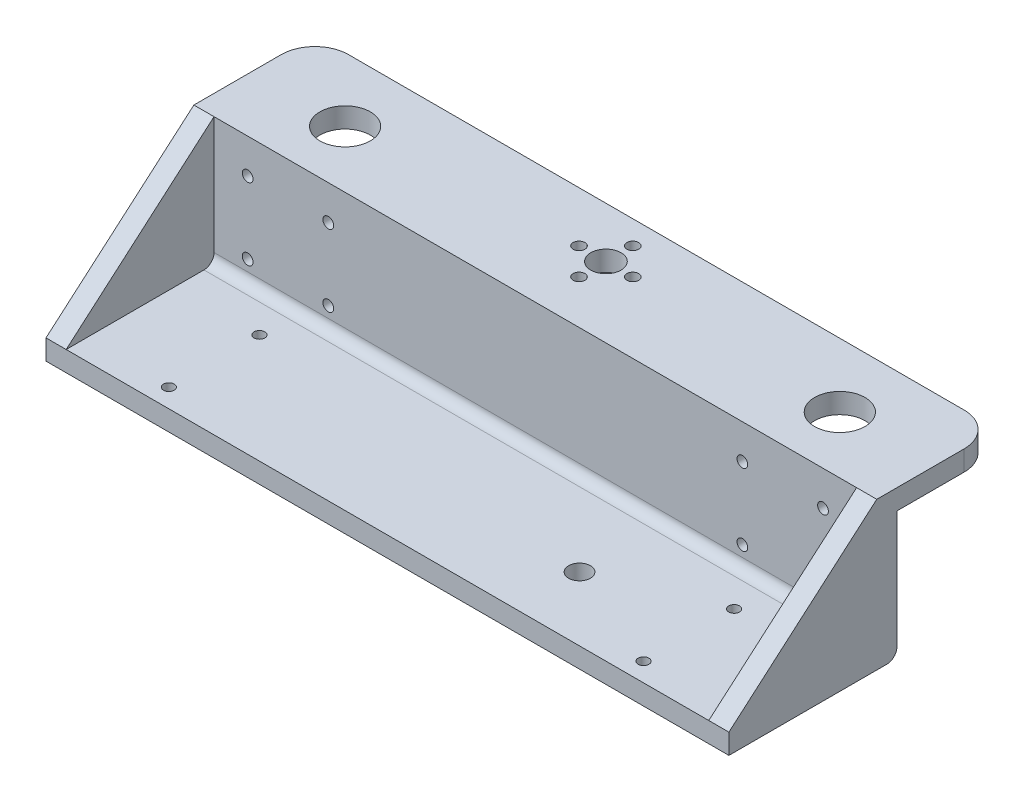
ISO-10303-21;
HEADER;
FILE_DESCRIPTION(('STEP AP214'),'2;1');
FILE_NAME('part.step','',(''),(''),'','','');
FILE_SCHEMA(('AUTOMOTIVE_DESIGN { 1 0 10303 214 1 1 1 1 }'));
ENDSEC;
DATA;
#1=APPLICATION_CONTEXT('core data for automotive mechanical design processes');
#2=APPLICATION_PROTOCOL_DEFINITION('international standard','automotive_design',2000,#1);
#3=PRODUCT_CONTEXT('',#1,'mechanical');
#4=PRODUCT('Part','Part','',(#3));
#5=PRODUCT_RELATED_PRODUCT_CATEGORY('part','',(#4));
#6=PRODUCT_DEFINITION_FORMATION('','',#4);
#7=PRODUCT_DEFINITION_CONTEXT('part definition',#1,'design');
#8=PRODUCT_DEFINITION('design','',#6,#7);
#9=PRODUCT_DEFINITION_SHAPE('','',#8);
#10=(LENGTH_UNIT() NAMED_UNIT(*) SI_UNIT(.MILLI.,.METRE.));
#11=(NAMED_UNIT(*) PLANE_ANGLE_UNIT() SI_UNIT($,.RADIAN.));
#12=(NAMED_UNIT(*) SI_UNIT($,.STERADIAN.) SOLID_ANGLE_UNIT());
#13=UNCERTAINTY_MEASURE_WITH_UNIT(LENGTH_MEASURE(1.E-05),#10,'distance_accuracy_value','');
#14=(GEOMETRIC_REPRESENTATION_CONTEXT(3) GLOBAL_UNCERTAINTY_ASSIGNED_CONTEXT((#13)) GLOBAL_UNIT_ASSIGNED_CONTEXT((#10,
#11,#12)) REPRESENTATION_CONTEXT('',''));
#15=CARTESIAN_POINT('',(0.,0.,0.));
#16=DIRECTION('',(0.,0.,1.));
#17=DIRECTION('',(1.,0.,0.));
#18=AXIS2_PLACEMENT_3D('',#15,#16,#17);
#19=CARTESIAN_POINT('',(0.,0.,6.));
#20=DIRECTION('',(0.,0.,-1.));
#21=DIRECTION('',(-1.,0.,0.));
#22=AXIS2_PLACEMENT_3D('',#19,#20,#21);
#23=PLANE('',#22);
#24=CARTESIAN_POINT('',(85.6,11.7,6.00000000000001));
#25=DIRECTION('',(0.,0.,-1.));
#26=DIRECTION('',(-1.,0.,0.));
#27=AXIS2_PLACEMENT_3D('',#24,#25,#26);
#28=CIRCLE('',#27,1.59999999999999);
#29=CARTESIAN_POINT('',(84.,11.7,6.00000000000001));
#30=VERTEX_POINT('',#29);
#31=EDGE_CURVE('E865',#30,#30,#28,.T.);
#32=ORIENTED_EDGE('',*,*,#31,.T.);
#33=EDGE_LOOP('',(#32));
#34=FACE_BOUND('',#33,.T.);
#35=CARTESIAN_POINT('',(61.6,11.7,6.00000000000001));
#36=DIRECTION('',(0.,0.,-1.));
#37=DIRECTION('',(-1.,0.,0.));
#38=AXIS2_PLACEMENT_3D('',#35,#36,#37);
#39=CIRCLE('',#38,1.59999999999999);
#40=CARTESIAN_POINT('',(60.,11.7,6.00000000000001));
#41=VERTEX_POINT('',#40);
#42=EDGE_CURVE('E857',#41,#41,#39,.T.);
#43=ORIENTED_EDGE('',*,*,#42,.T.);
#44=EDGE_LOOP('',(#43));
#45=FACE_BOUND('',#44,.T.);
#46=CARTESIAN_POINT('',(85.6,-9.7,6.00000000000001));
#47=DIRECTION('',(0.,0.,-1.));
#48=DIRECTION('',(-1.,0.,0.));
#49=AXIS2_PLACEMENT_3D('',#46,#47,#48);
#50=CIRCLE('',#49,1.59999999999999);
#51=CARTESIAN_POINT('',(84.,-9.7,6.00000000000001));
#52=VERTEX_POINT('',#51);
#53=EDGE_CURVE('E849',#52,#52,#50,.T.);
#54=ORIENTED_EDGE('',*,*,#53,.T.);
#55=EDGE_LOOP('',(#54));
#56=FACE_BOUND('',#55,.T.);
#57=CARTESIAN_POINT('',(61.6,-9.7,6.00000000000001));
#58=DIRECTION('',(0.,0.,-1.));
#59=DIRECTION('',(-1.,0.,0.));
#60=AXIS2_PLACEMENT_3D('',#57,#58,#59);
#61=CIRCLE('',#60,1.59999999999999);
#62=CARTESIAN_POINT('',(60.,-9.7,6.00000000000001));
#63=VERTEX_POINT('',#62);
#64=EDGE_CURVE('E841',#63,#63,#61,.T.);
#65=ORIENTED_EDGE('',*,*,#64,.T.);
#66=EDGE_LOOP('',(#65));
#67=FACE_BOUND('',#66,.T.);
#68=CARTESIAN_POINT('',(-61.6,11.7,6.00000000000001));
#69=DIRECTION('',(0.,0.,-1.));
#70=DIRECTION('',(-1.,0.,0.));
#71=AXIS2_PLACEMENT_3D('',#68,#69,#70);
#72=CIRCLE('',#71,1.59999999999999);
#73=CARTESIAN_POINT('',(-63.2,11.7,6.00000000000001));
#74=VERTEX_POINT('',#73);
#75=EDGE_CURVE('E833',#74,#74,#72,.T.);
#76=ORIENTED_EDGE('',*,*,#75,.T.);
#77=EDGE_LOOP('',(#76));
#78=FACE_BOUND('',#77,.T.);
#79=CARTESIAN_POINT('',(-85.6,11.7,6.00000000000001));
#80=DIRECTION('',(0.,0.,-1.));
#81=DIRECTION('',(-1.,0.,0.));
#82=AXIS2_PLACEMENT_3D('',#79,#80,#81);
#83=CIRCLE('',#82,1.59999999999999);
#84=CARTESIAN_POINT('',(-87.2,11.7,6.00000000000001));
#85=VERTEX_POINT('',#84);
#86=EDGE_CURVE('E807',#85,#85,#83,.T.);
#87=ORIENTED_EDGE('',*,*,#86,.T.);
#88=EDGE_LOOP('',(#87));
#89=FACE_BOUND('',#88,.T.);
#90=CARTESIAN_POINT('',(-61.6,-9.69999999999998,6.00000000000001));
#91=DIRECTION('',(0.,0.,-1.));
#92=DIRECTION('',(-1.,0.,0.));
#93=AXIS2_PLACEMENT_3D('',#90,#91,#92);
#94=CIRCLE('',#93,1.59999999999999);
#95=CARTESIAN_POINT('',(-63.2,-9.69999999999998,6.00000000000001));
#96=VERTEX_POINT('',#95);
#97=EDGE_CURVE('E801',#96,#96,#94,.T.);
#98=ORIENTED_EDGE('',*,*,#97,.T.);
#99=EDGE_LOOP('',(#98));
#100=FACE_BOUND('',#99,.T.);
#101=CARTESIAN_POINT('',(-85.6,-9.69999999999998,6.00000000000001));
#102=DIRECTION('',(0.,0.,-1.));
#103=DIRECTION('',(-1.,0.,0.));
#104=AXIS2_PLACEMENT_3D('',#101,#102,#103);
#105=CIRCLE('',#104,1.59999999999999);
#106=CARTESIAN_POINT('',(-87.2,-9.69999999999998,6.00000000000001));
#107=VERTEX_POINT('',#106);
#108=EDGE_CURVE('E821',#107,#107,#105,.T.);
#109=ORIENTED_EDGE('',*,*,#108,.T.);
#110=EDGE_LOOP('',(#109));
#111=FACE_BOUND('',#110,.T.);
#112=DIRECTION('',(0.,1.,0.));
#113=VECTOR('',#112,1.);
#114=CARTESIAN_POINT('',(-95.6,0.,6.));
#115=LINE('',#114,#113);
#116=CARTESIAN_POINT('',(-95.6,-13.,6.));
#117=VERTEX_POINT('',#116);
#118=CARTESIAN_POINT('',(-95.6,22.,6.));
#119=VERTEX_POINT('',#118);
#120=EDGE_CURVE('E151',#117,#119,#115,.T.);
#121=ORIENTED_EDGE('',*,*,#120,.F.);
#122=DIRECTION('',(1.,0.,0.));
#123=VECTOR('',#122,1.);
#124=CARTESIAN_POINT('',(95.6,-13.,6.));
#125=LINE('',#124,#123);
#126=CARTESIAN_POINT('',(95.6,-13.,6.));
#127=VERTEX_POINT('',#126);
#128=EDGE_CURVE('E305',#117,#127,#125,.T.);
#129=ORIENTED_EDGE('',*,*,#128,.T.);
#130=DIRECTION('',(0.,-1.,0.));
#131=VECTOR('',#130,1.);
#132=CARTESIAN_POINT('',(95.6,0.,6.));
#133=LINE('',#132,#131);
#134=CARTESIAN_POINT('',(95.6,22.,6.));
#135=VERTEX_POINT('',#134);
#136=EDGE_CURVE('E183',#135,#127,#133,.T.);
#137=ORIENTED_EDGE('',*,*,#136,.F.);
#138=DIRECTION('',(1.,0.,0.));
#139=VECTOR('',#138,1.);
#140=CARTESIAN_POINT('',(101.6,22.,6.));
#141=LINE('',#140,#139);
#142=EDGE_CURVE('E268',#119,#135,#141,.T.);
#143=ORIENTED_EDGE('',*,*,#142,.F.);
#144=EDGE_LOOP('',(#121,#129,#137,#143));
#145=FACE_BOUND('',#144,.T.);
#146=ADVANCED_FACE('F39',(#34,#45,#56,#67,#78,#89,#100,#111,#145),#23,.F.);
#147=CARTESIAN_POINT('',(0.,-16.,0.));
#148=DIRECTION('',(0.,-1.,0.));
#149=DIRECTION('',(0.,0.,-1.));
#150=AXIS2_PLACEMENT_3D('',#147,#148,#149);
#151=PLANE('',#150);
#152=CARTESIAN_POINT('',(-70.62,-16.,17.48));
#153=DIRECTION('',(0.,1.,0.));
#154=DIRECTION('',(0.,0.,1.));
#155=AXIS2_PLACEMENT_3D('',#152,#153,#154);
#156=CIRCLE('',#155,1.6);
#157=CARTESIAN_POINT('',(-70.62,-16.,19.08));
#158=VERTEX_POINT('',#157);
#159=EDGE_CURVE('E908',#158,#158,#156,.T.);
#160=ORIENTED_EDGE('',*,*,#159,.F.);
#161=EDGE_LOOP('',(#160));
#162=FACE_BOUND('',#161,.T.);
#163=CARTESIAN_POINT('',(-70.62,-16.,44.42));
#164=DIRECTION('',(0.,1.,0.));
#165=DIRECTION('',(0.,0.,1.));
#166=AXIS2_PLACEMENT_3D('',#163,#164,#165);
#167=CIRCLE('',#166,1.6);
#168=CARTESIAN_POINT('',(-70.62,-16.,46.02));
#169=VERTEX_POINT('',#168);
#170=EDGE_CURVE('E900',#169,#169,#167,.T.);
#171=ORIENTED_EDGE('',*,*,#170,.F.);
#172=EDGE_LOOP('',(#171));
#173=FACE_BOUND('',#172,.T.);
#174=CARTESIAN_POINT('',(70.62,-16.,17.48));
#175=DIRECTION('',(0.,1.,0.));
#176=DIRECTION('',(0.,0.,1.));
#177=AXIS2_PLACEMENT_3D('',#174,#175,#176);
#178=CIRCLE('',#177,1.6);
#179=CARTESIAN_POINT('',(70.62,-16.,19.08));
#180=VERTEX_POINT('',#179);
#181=EDGE_CURVE('E892',#180,#180,#178,.T.);
#182=ORIENTED_EDGE('',*,*,#181,.F.);
#183=EDGE_LOOP('',(#182));
#184=FACE_BOUND('',#183,.T.);
#185=CARTESIAN_POINT('',(70.62,-16.,44.42));
#186=DIRECTION('',(0.,1.,0.));
#187=DIRECTION('',(0.,0.,1.));
#188=AXIS2_PLACEMENT_3D('',#185,#186,#187);
#189=CIRCLE('',#188,1.6);
#190=CARTESIAN_POINT('',(70.62,-16.,46.02));
#191=VERTEX_POINT('',#190);
#192=EDGE_CURVE('E884',#191,#191,#189,.T.);
#193=ORIENTED_EDGE('',*,*,#192,.F.);
#194=EDGE_LOOP('',(#193));
#195=FACE_BOUND('',#194,.T.);
#196=CARTESIAN_POINT('',(38.1,-16.,30.95));
#197=DIRECTION('',(0.,-1.,0.));
#198=DIRECTION('',(0.,0.,-1.));
#199=AXIS2_PLACEMENT_3D('',#196,#197,#198);
#200=CIRCLE('',#199,3.2385);
#201=CARTESIAN_POINT('',(38.1,-16.,27.7115));
#202=VERTEX_POINT('',#201);
#203=EDGE_CURVE('E872',#202,#202,#200,.T.);
#204=ORIENTED_EDGE('',*,*,#203,.T.);
#205=EDGE_LOOP('',(#204));
#206=FACE_BOUND('',#205,.T.);
#207=DIRECTION('',(0.,0.,-1.));
#208=VECTOR('',#207,1.);
#209=CARTESIAN_POINT('',(95.6,-16.,0.));
#210=LINE('',#209,#208);
#211=CARTESIAN_POINT('',(95.6,-16.,50.));
#212=VERTEX_POINT('',#211);
#213=CARTESIAN_POINT('',(95.6,-16.,9.));
#214=VERTEX_POINT('',#213);
#215=EDGE_CURVE('E408',#212,#214,#210,.T.);
#216=ORIENTED_EDGE('',*,*,#215,.T.);
#217=DIRECTION('',(1.,0.,0.));
#218=VECTOR('',#217,1.);
#219=CARTESIAN_POINT('',(-95.6,-16.,9.));
#220=LINE('',#219,#218);
#221=CARTESIAN_POINT('',(-95.6,-16.,9.));
#222=VERTEX_POINT('',#221);
#223=EDGE_CURVE('E175',#214,#222,#220,.F.);
#224=ORIENTED_EDGE('',*,*,#223,.T.);
#225=DIRECTION('',(0.,0.,-1.));
#226=VECTOR('',#225,1.);
#227=CARTESIAN_POINT('',(-95.6,-16.,0.));
#228=LINE('',#227,#226);
#229=CARTESIAN_POINT('',(-95.6,-16.,50.));
#230=VERTEX_POINT('',#229);
#231=EDGE_CURVE('E148',#230,#222,#228,.T.);
#232=ORIENTED_EDGE('',*,*,#231,.F.);
#233=DIRECTION('',(-1.,0.,0.));
#234=VECTOR('',#233,1.);
#235=CARTESIAN_POINT('',(101.6,-16.,50.));
#236=LINE('',#235,#234);
#237=EDGE_CURVE('E172',#212,#230,#236,.T.);
#238=ORIENTED_EDGE('',*,*,#237,.F.);
#239=EDGE_LOOP('',(#216,#224,#232,#238));
#240=FACE_BOUND('',#239,.T.);
#241=ADVANCED_FACE('F171',(#162,#173,#184,#195,#206,#240),#151,.F.);
#242=CARTESIAN_POINT('',(101.6,-16.,6.));
#243=DIRECTION('',(-1.,0.,0.));
#244=DIRECTION('',(0.,0.,1.));
#245=AXIS2_PLACEMENT_3D('',#242,#243,#244);
#246=PLANE('',#245);
#247=DIRECTION('',(0.,0.,-1.));
#248=VECTOR('',#247,1.);
#249=CARTESIAN_POINT('',(101.6,16.,6.));
#250=LINE('',#249,#248);
#251=CARTESIAN_POINT('',(101.6,16.,0.));
#252=VERTEX_POINT('',#251);
#253=CARTESIAN_POINT('',(101.6,16.,-20.));
#254=VERTEX_POINT('',#253);
#255=EDGE_CURVE('E257',#252,#254,#250,.T.);
#256=ORIENTED_EDGE('',*,*,#255,.T.);
#257=DIRECTION('',(0.,-1.,0.));
#258=VECTOR('',#257,1.);
#259=CARTESIAN_POINT('',(101.6,-16.,-20.));
#260=LINE('',#259,#258);
#261=CARTESIAN_POINT('',(101.6,22.,-20.));
#262=VERTEX_POINT('',#261);
#263=EDGE_CURVE('E63',#254,#262,#260,.F.);
#264=ORIENTED_EDGE('',*,*,#263,.T.);
#265=DIRECTION('',(0.,0.,-1.));
#266=VECTOR('',#265,1.);
#267=CARTESIAN_POINT('',(101.6,22.,6.));
#268=LINE('',#267,#266);
#269=CARTESIAN_POINT('',(101.6,22.,6.));
#270=VERTEX_POINT('',#269);
#271=EDGE_CURVE('E258',#270,#262,#268,.T.);
#272=ORIENTED_EDGE('',*,*,#271,.F.);
#273=DIRECTION('',(0.,-0.653619870346092,0.75682300776916));
#274=VECTOR('',#273,1.);
#275=CARTESIAN_POINT('',(101.6,-16.,50.));
#276=LINE('',#275,#274);
#277=CARTESIAN_POINT('',(101.6,-16.,50.));
#278=VERTEX_POINT('',#277);
#279=EDGE_CURVE('E405',#270,#278,#276,.T.);
#280=ORIENTED_EDGE('',*,*,#279,.T.);
#281=DIRECTION('',(0.,1.,0.));
#282=VECTOR('',#281,1.);
#283=CARTESIAN_POINT('',(101.6,-22.,50.));
#284=LINE('',#283,#282);
#285=CARTESIAN_POINT('',(101.6,-22.,50.));
#286=VERTEX_POINT('',#285);
#287=EDGE_CURVE('E198',#286,#278,#284,.T.);
#288=ORIENTED_EDGE('',*,*,#287,.F.);
#289=DIRECTION('',(0.,0.,1.));
#290=VECTOR('',#289,1.);
#291=CARTESIAN_POINT('',(101.6,-22.,0.));
#292=LINE('',#291,#290);
#293=CARTESIAN_POINT('',(101.6,-22.,3.));
#294=VERTEX_POINT('',#293);
#295=EDGE_CURVE('E187',#294,#286,#292,.T.);
#296=ORIENTED_EDGE('',*,*,#295,.F.);
#297=CARTESIAN_POINT('',(101.6,-19.,3.));
#298=DIRECTION('',(-1.,0.,0.));
#299=DIRECTION('',(0.,0.,1.));
#300=AXIS2_PLACEMENT_3D('',#297,#298,#299);
#301=CIRCLE('',#300,3.);
#302=CARTESIAN_POINT('',(101.6,-19.,0.));
#303=VERTEX_POINT('',#302);
#304=EDGE_CURVE('E296',#294,#303,#301,.F.);
#305=ORIENTED_EDGE('',*,*,#304,.T.);
#306=DIRECTION('',(0.,1.,0.));
#307=VECTOR('',#306,1.);
#308=CARTESIAN_POINT('',(101.6,-16.,0.));
#309=LINE('',#308,#307);
#310=EDGE_CURVE('E273',#303,#252,#309,.T.);
#311=ORIENTED_EDGE('',*,*,#310,.T.);
#312=EDGE_LOOP('',(#256,#264,#272,#280,#288,#296,#305,#311));
#313=FACE_BOUND('',#312,.T.);
#314=ADVANCED_FACE('F349',(#313),#246,.F.);
#315=CARTESIAN_POINT('',(-101.6,-16.,6.));
#316=DIRECTION('',(1.,0.,0.));
#317=DIRECTION('',(0.,0.,-1.));
#318=AXIS2_PLACEMENT_3D('',#315,#316,#317);
#319=PLANE('',#318);
#320=DIRECTION('',(0.,0.,1.));
#321=VECTOR('',#320,1.);
#322=CARTESIAN_POINT('',(-101.6,22.,6.));
#323=LINE('',#322,#321);
#324=CARTESIAN_POINT('',(-101.6,22.,-20.));
#325=VERTEX_POINT('',#324);
#326=CARTESIAN_POINT('',(-101.6,22.,6.));
#327=VERTEX_POINT('',#326);
#328=EDGE_CURVE('E265',#325,#327,#323,.T.);
#329=ORIENTED_EDGE('',*,*,#328,.F.);
#330=DIRECTION('',(0.,-1.,0.));
#331=VECTOR('',#330,1.);
#332=CARTESIAN_POINT('',(-101.6,-16.,-20.));
#333=LINE('',#332,#331);
#334=CARTESIAN_POINT('',(-101.6,16.,-20.));
#335=VERTEX_POINT('',#334);
#336=EDGE_CURVE('E11',#325,#335,#333,.T.);
#337=ORIENTED_EDGE('',*,*,#336,.T.);
#338=DIRECTION('',(0.,0.,1.));
#339=VECTOR('',#338,1.);
#340=CARTESIAN_POINT('',(-101.6,16.,6.));
#341=LINE('',#340,#339);
#342=CARTESIAN_POINT('',(-101.6,16.,0.));
#343=VERTEX_POINT('',#342);
#344=EDGE_CURVE('E262',#335,#343,#341,.T.);
#345=ORIENTED_EDGE('',*,*,#344,.T.);
#346=DIRECTION('',(0.,-1.,0.));
#347=VECTOR('',#346,1.);
#348=CARTESIAN_POINT('',(-101.6,-16.,0.));
#349=LINE('',#348,#347);
#350=CARTESIAN_POINT('',(-101.6,-19.,0.));
#351=VERTEX_POINT('',#350);
#352=EDGE_CURVE('E288',#343,#351,#349,.T.);
#353=ORIENTED_EDGE('',*,*,#352,.T.);
#354=CARTESIAN_POINT('',(-101.6,-19.,3.));
#355=DIRECTION('',(1.,0.,0.));
#356=DIRECTION('',(0.,0.,-1.));
#357=AXIS2_PLACEMENT_3D('',#354,#355,#356);
#358=CIRCLE('',#357,3.);
#359=CARTESIAN_POINT('',(-101.6,-22.,3.));
#360=VERTEX_POINT('',#359);
#361=EDGE_CURVE('E302',#351,#360,#358,.F.);
#362=ORIENTED_EDGE('',*,*,#361,.T.);
#363=DIRECTION('',(0.,0.,-1.));
#364=VECTOR('',#363,1.);
#365=CARTESIAN_POINT('',(-101.6,-22.,0.));
#366=LINE('',#365,#364);
#367=CARTESIAN_POINT('',(-101.6,-22.,50.));
#368=VERTEX_POINT('',#367);
#369=EDGE_CURVE('E193',#368,#360,#366,.T.);
#370=ORIENTED_EDGE('',*,*,#369,.F.);
#371=DIRECTION('',(0.,1.,0.));
#372=VECTOR('',#371,1.);
#373=CARTESIAN_POINT('',(-101.6,-22.,50.));
#374=LINE('',#373,#372);
#375=CARTESIAN_POINT('',(-101.6,-16.,50.));
#376=VERTEX_POINT('',#375);
#377=EDGE_CURVE('E195',#368,#376,#374,.T.);
#378=ORIENTED_EDGE('',*,*,#377,.T.);
#379=DIRECTION('',(0.,-0.653619870346092,0.75682300776916));
#380=VECTOR('',#379,1.);
#381=CARTESIAN_POINT('',(-101.6,-16.,50.));
#382=LINE('',#381,#380);
#383=EDGE_CURVE('E161',#327,#376,#382,.T.);
#384=ORIENTED_EDGE('',*,*,#383,.F.);
#385=EDGE_LOOP('',(#329,#337,#345,#353,#362,#370,#378,#384));
#386=FACE_BOUND('',#385,.T.);
#387=ADVANCED_FACE('F359',(#386),#319,.F.);
#388=CARTESIAN_POINT('',(0.,0.,0.));
#389=DIRECTION('',(0.,0.,-1.));
#390=DIRECTION('',(-1.,0.,0.));
#391=AXIS2_PLACEMENT_3D('',#388,#389,#390);
#392=PLANE('',#391);
#393=CARTESIAN_POINT('',(85.6,11.7,0.));
#394=DIRECTION('',(0.,0.,-1.));
#395=DIRECTION('',(-1.,0.,0.));
#396=AXIS2_PLACEMENT_3D('',#393,#394,#395);
#397=CIRCLE('',#396,1.59999999999999);
#398=CARTESIAN_POINT('',(84.,11.7,0.));
#399=VERTEX_POINT('',#398);
#400=EDGE_CURVE('E868',#399,#399,#397,.T.);
#401=ORIENTED_EDGE('',*,*,#400,.F.);
#402=EDGE_LOOP('',(#401));
#403=FACE_BOUND('',#402,.T.);
#404=CARTESIAN_POINT('',(61.6,11.7,0.));
#405=DIRECTION('',(0.,0.,-1.));
#406=DIRECTION('',(-1.,0.,0.));
#407=AXIS2_PLACEMENT_3D('',#404,#405,#406);
#408=CIRCLE('',#407,1.59999999999999);
#409=CARTESIAN_POINT('',(60.,11.7,0.));
#410=VERTEX_POINT('',#409);
#411=EDGE_CURVE('E861',#410,#410,#408,.T.);
#412=ORIENTED_EDGE('',*,*,#411,.F.);
#413=EDGE_LOOP('',(#412));
#414=FACE_BOUND('',#413,.T.);
#415=CARTESIAN_POINT('',(85.6,-9.7,0.));
#416=DIRECTION('',(0.,0.,-1.));
#417=DIRECTION('',(-1.,0.,0.));
#418=AXIS2_PLACEMENT_3D('',#415,#416,#417);
#419=CIRCLE('',#418,1.59999999999999);
#420=CARTESIAN_POINT('',(84.,-9.7,0.));
#421=VERTEX_POINT('',#420);
#422=EDGE_CURVE('E853',#421,#421,#419,.T.);
#423=ORIENTED_EDGE('',*,*,#422,.F.);
#424=EDGE_LOOP('',(#423));
#425=FACE_BOUND('',#424,.T.);
#426=CARTESIAN_POINT('',(61.6,-9.7,0.));
#427=DIRECTION('',(0.,0.,-1.));
#428=DIRECTION('',(-1.,0.,0.));
#429=AXIS2_PLACEMENT_3D('',#426,#427,#428);
#430=CIRCLE('',#429,1.59999999999999);
#431=CARTESIAN_POINT('',(60.,-9.7,0.));
#432=VERTEX_POINT('',#431);
#433=EDGE_CURVE('E845',#432,#432,#430,.T.);
#434=ORIENTED_EDGE('',*,*,#433,.F.);
#435=EDGE_LOOP('',(#434));
#436=FACE_BOUND('',#435,.T.);
#437=CARTESIAN_POINT('',(-61.6,11.7,0.));
#438=DIRECTION('',(0.,0.,-1.));
#439=DIRECTION('',(-1.,0.,0.));
#440=AXIS2_PLACEMENT_3D('',#437,#438,#439);
#441=CIRCLE('',#440,1.59999999999999);
#442=CARTESIAN_POINT('',(-63.2,11.7,0.));
#443=VERTEX_POINT('',#442);
#444=EDGE_CURVE('E837',#443,#443,#441,.T.);
#445=ORIENTED_EDGE('',*,*,#444,.F.);
#446=EDGE_LOOP('',(#445));
#447=FACE_BOUND('',#446,.T.);
#448=CARTESIAN_POINT('',(-85.6,11.7,0.));
#449=DIRECTION('',(0.,0.,-1.));
#450=DIRECTION('',(-1.,0.,0.));
#451=AXIS2_PLACEMENT_3D('',#448,#449,#450);
#452=CIRCLE('',#451,1.59999999999999);
#453=CARTESIAN_POINT('',(-87.2,11.7,0.));
#454=VERTEX_POINT('',#453);
#455=EDGE_CURVE('E814',#454,#454,#452,.T.);
#456=ORIENTED_EDGE('',*,*,#455,.F.);
#457=EDGE_LOOP('',(#456));
#458=FACE_BOUND('',#457,.T.);
#459=CARTESIAN_POINT('',(-61.6,-9.69999999999998,0.));
#460=DIRECTION('',(0.,0.,-1.));
#461=DIRECTION('',(-1.,0.,0.));
#462=AXIS2_PLACEMENT_3D('',#459,#460,#461);
#463=CIRCLE('',#462,1.59999999999999);
#464=CARTESIAN_POINT('',(-63.2,-9.69999999999998,0.));
#465=VERTEX_POINT('',#464);
#466=EDGE_CURVE('E804',#465,#465,#463,.T.);
#467=ORIENTED_EDGE('',*,*,#466,.F.);
#468=EDGE_LOOP('',(#467));
#469=FACE_BOUND('',#468,.T.);
#470=CARTESIAN_POINT('',(-85.6,-9.69999999999998,0.));
#471=DIRECTION('',(0.,0.,-1.));
#472=DIRECTION('',(-1.,0.,0.));
#473=AXIS2_PLACEMENT_3D('',#470,#471,#472);
#474=CIRCLE('',#473,1.59999999999999);
#475=CARTESIAN_POINT('',(-87.2,-9.69999999999998,0.));
#476=VERTEX_POINT('',#475);
#477=EDGE_CURVE('E811',#476,#476,#474,.T.);
#478=ORIENTED_EDGE('',*,*,#477,.F.);
#479=EDGE_LOOP('',(#478));
#480=FACE_BOUND('',#479,.T.);
#481=ORIENTED_EDGE('',*,*,#310,.F.);
#482=DIRECTION('',(1.,0.,0.));
#483=VECTOR('',#482,1.);
#484=CARTESIAN_POINT('',(0.,-19.,0.));
#485=LINE('',#484,#483);
#486=EDGE_CURVE('E299',#303,#351,#485,.F.);
#487=ORIENTED_EDGE('',*,*,#486,.T.);
#488=ORIENTED_EDGE('',*,*,#352,.F.);
#489=DIRECTION('',(-1.,0.,0.));
#490=VECTOR('',#489,1.);
#491=CARTESIAN_POINT('',(-101.6,16.,0.));
#492=LINE('',#491,#490);
#493=EDGE_CURVE('E284',#252,#343,#492,.T.);
#494=ORIENTED_EDGE('',*,*,#493,.F.);
#495=EDGE_LOOP('',(#481,#487,#488,#494));
#496=FACE_BOUND('',#495,.T.);
#497=ADVANCED_FACE('F356',(#403,#414,#425,#436,#447,#458,#469,#480,#496),#392,.T.);
#498=CARTESIAN_POINT('',(0.,16.,0.));
#499=DIRECTION('',(0.,1.,0.));
#500=DIRECTION('',(0.,0.,1.));
#501=AXIS2_PLACEMENT_3D('',#498,#499,#500);
#502=PLANE('',#501);
#503=CARTESIAN_POINT('',(-73.6,16.,-11.));
#504=DIRECTION('',(0.,1.,0.));
#505=DIRECTION('',(0.,0.,1.));
#506=AXIS2_PLACEMENT_3D('',#503,#504,#505);
#507=CIRCLE('',#506,7.5);
#508=CARTESIAN_POINT('',(-73.6,16.,-3.5));
#509=VERTEX_POINT('',#508);
#510=EDGE_CURVE('E253',#509,#509,#507,.T.);
#511=ORIENTED_EDGE('',*,*,#510,.T.);
#512=EDGE_LOOP('',(#511));
#513=FACE_BOUND('',#512,.T.);
#514=CARTESIAN_POINT('',(-8.,16.,-15.));
#515=DIRECTION('',(0.,1.,0.));
#516=DIRECTION('',(0.,0.,1.));
#517=AXIS2_PLACEMENT_3D('',#514,#515,#516);
#518=CIRCLE('',#517,1.75);
#519=CARTESIAN_POINT('',(-8.,16.,-13.25));
#520=VERTEX_POINT('',#519);
#521=EDGE_CURVE('E249',#520,#520,#518,.T.);
#522=ORIENTED_EDGE('',*,*,#521,.T.);
#523=EDGE_LOOP('',(#522));
#524=FACE_BOUND('',#523,.T.);
#525=CARTESIAN_POINT('',(8.,16.,-15.));
#526=DIRECTION('',(0.,1.,0.));
#527=DIRECTION('',(0.,0.,1.));
#528=AXIS2_PLACEMENT_3D('',#525,#526,#527);
#529=CIRCLE('',#528,1.75);
#530=CARTESIAN_POINT('',(8.,16.,-13.25));
#531=VERTEX_POINT('',#530);
#532=EDGE_CURVE('E245',#531,#531,#529,.T.);
#533=ORIENTED_EDGE('',*,*,#532,.T.);
#534=EDGE_LOOP('',(#533));
#535=FACE_BOUND('',#534,.T.);
#536=CARTESIAN_POINT('',(73.6,16.,-11.));
#537=DIRECTION('',(0.,1.,0.));
#538=DIRECTION('',(0.,0.,1.));
#539=AXIS2_PLACEMENT_3D('',#536,#537,#538);
#540=CIRCLE('',#539,7.50000000000001);
#541=CARTESIAN_POINT('',(73.6,16.,-3.49999999999999));
#542=VERTEX_POINT('',#541);
#543=EDGE_CURVE('E241',#542,#542,#540,.T.);
#544=ORIENTED_EDGE('',*,*,#543,.T.);
#545=EDGE_LOOP('',(#544));
#546=FACE_BOUND('',#545,.T.);
#547=CARTESIAN_POINT('',(0.,16.,-15.));
#548=DIRECTION('',(0.,1.,0.));
#549=DIRECTION('',(0.,0.,1.));
#550=AXIS2_PLACEMENT_3D('',#547,#548,#549);
#551=CIRCLE('',#550,4.5);
#552=CARTESIAN_POINT('',(0.,16.,-10.5));
#553=VERTEX_POINT('',#552);
#554=EDGE_CURVE('E237',#553,#553,#551,.T.);
#555=ORIENTED_EDGE('',*,*,#554,.T.);
#556=EDGE_LOOP('',(#555));
#557=FACE_BOUND('',#556,.T.);
#558=CARTESIAN_POINT('',(0.,16.,-23.));
#559=DIRECTION('',(0.,1.,0.));
#560=DIRECTION('',(0.,0.,1.));
#561=AXIS2_PLACEMENT_3D('',#558,#559,#560);
#562=CIRCLE('',#561,1.75);
#563=CARTESIAN_POINT('',(0.,16.,-21.25));
#564=VERTEX_POINT('',#563);
#565=EDGE_CURVE('E233',#564,#564,#562,.T.);
#566=ORIENTED_EDGE('',*,*,#565,.T.);
#567=EDGE_LOOP('',(#566));
#568=FACE_BOUND('',#567,.T.);
#569=CARTESIAN_POINT('',(0.,16.,-7.));
#570=DIRECTION('',(0.,1.,0.));
#571=DIRECTION('',(0.,0.,1.));
#572=AXIS2_PLACEMENT_3D('',#569,#570,#571);
#573=CIRCLE('',#572,1.75);
#574=CARTESIAN_POINT('',(0.,16.,-5.25));
#575=VERTEX_POINT('',#574);
#576=EDGE_CURVE('E206',#575,#575,#573,.T.);
#577=ORIENTED_EDGE('',*,*,#576,.T.);
#578=EDGE_LOOP('',(#577));
#579=FACE_BOUND('',#578,.T.);
#580=DIRECTION('',(-1.,0.,0.));
#581=VECTOR('',#580,1.);
#582=CARTESIAN_POINT('',(101.6,16.,-30.));
#583=LINE('',#582,#581);
#584=CARTESIAN_POINT('',(91.6,16.,-30.));
#585=VERTEX_POINT('',#584);
#586=CARTESIAN_POINT('',(-91.6,16.,-30.));
#587=VERTEX_POINT('',#586);
#588=EDGE_CURVE('E276',#585,#587,#583,.T.);
#589=ORIENTED_EDGE('',*,*,#588,.F.);
#590=CARTESIAN_POINT('',(91.6,16.,-20.));
#591=DIRECTION('',(0.,1.,0.));
#592=DIRECTION('',(0.,0.,1.));
#593=AXIS2_PLACEMENT_3D('',#590,#591,#592);
#594=CIRCLE('',#593,10.);
#595=EDGE_CURVE('E327',#585,#254,#594,.F.);
#596=ORIENTED_EDGE('',*,*,#595,.T.);
#597=ORIENTED_EDGE('',*,*,#255,.F.);
#598=ORIENTED_EDGE('',*,*,#493,.T.);
#599=ORIENTED_EDGE('',*,*,#344,.F.);
#600=CARTESIAN_POINT('',(-91.6,16.,-20.));
#601=DIRECTION('',(0.,1.,0.));
#602=DIRECTION('',(0.,0.,1.));
#603=AXIS2_PLACEMENT_3D('',#600,#601,#602);
#604=CIRCLE('',#603,10.);
#605=EDGE_CURVE('E324',#335,#587,#604,.F.);
#606=ORIENTED_EDGE('',*,*,#605,.T.);
#607=EDGE_LOOP('',(#589,#596,#597,#598,#599,#606));
#608=FACE_BOUND('',#607,.T.);
#609=ADVANCED_FACE('F348',(#513,#524,#535,#546,#557,#568,#579,#608),#502,.F.);
#610=CARTESIAN_POINT('',(101.6,22.,-30.));
#611=DIRECTION('',(0.,0.,1.));
#612=DIRECTION('',(1.,0.,0.));
#613=AXIS2_PLACEMENT_3D('',#610,#611,#612);
#614=PLANE('',#613);
#615=DIRECTION('',(-1.,0.,0.));
#616=VECTOR('',#615,1.);
#617=CARTESIAN_POINT('',(101.6,22.,-30.));
#618=LINE('',#617,#616);
#619=CARTESIAN_POINT('',(91.6,22.,-30.));
#620=VERTEX_POINT('',#619);
#621=CARTESIAN_POINT('',(-91.6,22.,-30.));
#622=VERTEX_POINT('',#621);
#623=EDGE_CURVE('E261',#620,#622,#618,.T.);
#624=ORIENTED_EDGE('',*,*,#623,.F.);
#625=DIRECTION('',(0.,-1.,0.));
#626=VECTOR('',#625,1.);
#627=CARTESIAN_POINT('',(91.6,22.,-30.));
#628=LINE('',#627,#626);
#629=EDGE_CURVE('E320',#620,#585,#628,.T.);
#630=ORIENTED_EDGE('',*,*,#629,.T.);
#631=ORIENTED_EDGE('',*,*,#588,.T.);
#632=DIRECTION('',(0.,-1.,0.));
#633=VECTOR('',#632,1.);
#634=CARTESIAN_POINT('',(-91.6,22.,-30.));
#635=LINE('',#634,#633);
#636=EDGE_CURVE('E317',#587,#622,#635,.F.);
#637=ORIENTED_EDGE('',*,*,#636,.T.);
#638=EDGE_LOOP('',(#624,#630,#631,#637));
#639=FACE_BOUND('',#638,.T.);
#640=ADVANCED_FACE('F342',(#639),#614,.F.);
#641=CARTESIAN_POINT('',(0.,22.,0.));
#642=DIRECTION('',(0.,1.,0.));
#643=DIRECTION('',(0.,0.,1.));
#644=AXIS2_PLACEMENT_3D('',#641,#642,#643);
#645=PLANE('',#644);
#646=ORIENTED_EDGE('',*,*,#271,.T.);
#647=CARTESIAN_POINT('',(91.6,22.,-20.));
#648=DIRECTION('',(0.,1.,0.));
#649=DIRECTION('',(0.,0.,1.));
#650=AXIS2_PLACEMENT_3D('',#647,#648,#649);
#651=CIRCLE('',#650,10.);
#652=EDGE_CURVE('E48',#262,#620,#651,.T.);
#653=ORIENTED_EDGE('',*,*,#652,.T.);
#654=ORIENTED_EDGE('',*,*,#623,.T.);
#655=CARTESIAN_POINT('',(-91.6,22.,-20.));
#656=DIRECTION('',(0.,1.,0.));
#657=DIRECTION('',(0.,0.,1.));
#658=AXIS2_PLACEMENT_3D('',#655,#656,#657);
#659=CIRCLE('',#658,10.);
#660=EDGE_CURVE('E55',#622,#325,#659,.T.);
#661=ORIENTED_EDGE('',*,*,#660,.T.);
#662=ORIENTED_EDGE('',*,*,#328,.T.);
#663=EDGE_CURVE('E269',#327,#119,#141,.T.);
#664=ORIENTED_EDGE('',*,*,#663,.T.);
#665=ORIENTED_EDGE('',*,*,#142,.T.);
#666=DIRECTION('',(1.,0.,0.));
#667=VECTOR('',#666,1.);
#668=CARTESIAN_POINT('',(95.6,22.,6.));
#669=LINE('',#668,#667);
#670=EDGE_CURVE('E189',#135,#270,#669,.T.);
#671=ORIENTED_EDGE('',*,*,#670,.T.);
#672=EDGE_LOOP('',(#646,#653,#654,#661,#662,#664,#665,#671));
#673=FACE_BOUND('',#672,.T.);
#674=CARTESIAN_POINT('',(-73.6,22.,-11.));
#675=DIRECTION('',(0.,1.,0.));
#676=DIRECTION('',(0.,0.,1.));
#677=AXIS2_PLACEMENT_3D('',#674,#675,#676);
#678=CIRCLE('',#677,7.5);
#679=CARTESIAN_POINT('',(-73.6,22.,-3.5));
#680=VERTEX_POINT('',#679);
#681=EDGE_CURVE('E202',#680,#680,#678,.T.);
#682=ORIENTED_EDGE('',*,*,#681,.F.);
#683=EDGE_LOOP('',(#682));
#684=FACE_BOUND('',#683,.T.);
#685=CARTESIAN_POINT('',(-8.,22.,-15.));
#686=DIRECTION('',(0.,1.,0.));
#687=DIRECTION('',(0.,0.,1.));
#688=AXIS2_PLACEMENT_3D('',#685,#686,#687);
#689=CIRCLE('',#688,1.75);
#690=CARTESIAN_POINT('',(-8.,22.,-13.25));
#691=VERTEX_POINT('',#690);
#692=EDGE_CURVE('E201',#691,#691,#689,.T.);
#693=ORIENTED_EDGE('',*,*,#692,.F.);
#694=EDGE_LOOP('',(#693));
#695=FACE_BOUND('',#694,.T.);
#696=CARTESIAN_POINT('',(8.,22.,-15.));
#697=DIRECTION('',(0.,1.,0.));
#698=DIRECTION('',(0.,0.,1.));
#699=AXIS2_PLACEMENT_3D('',#696,#697,#698);
#700=CIRCLE('',#699,1.75);
#701=CARTESIAN_POINT('',(8.,22.,-13.25));
#702=VERTEX_POINT('',#701);
#703=EDGE_CURVE('E208',#702,#702,#700,.T.);
#704=ORIENTED_EDGE('',*,*,#703,.F.);
#705=EDGE_LOOP('',(#704));
#706=FACE_BOUND('',#705,.T.);
#707=CARTESIAN_POINT('',(73.6,22.,-11.));
#708=DIRECTION('',(0.,1.,0.));
#709=DIRECTION('',(0.,0.,1.));
#710=AXIS2_PLACEMENT_3D('',#707,#708,#709);
#711=CIRCLE('',#710,7.50000000000001);
#712=CARTESIAN_POINT('',(73.6,22.,-3.49999999999999));
#713=VERTEX_POINT('',#712);
#714=EDGE_CURVE('E207',#713,#713,#711,.T.);
#715=ORIENTED_EDGE('',*,*,#714,.F.);
#716=EDGE_LOOP('',(#715));
#717=FACE_BOUND('',#716,.T.);
#718=CARTESIAN_POINT('',(0.,22.,-15.));
#719=DIRECTION('',(0.,1.,0.));
#720=DIRECTION('',(0.,0.,1.));
#721=AXIS2_PLACEMENT_3D('',#718,#719,#720);
#722=CIRCLE('',#721,4.5);
#723=CARTESIAN_POINT('',(0.,22.,-10.5));
#724=VERTEX_POINT('',#723);
#725=EDGE_CURVE('E220',#724,#724,#722,.T.);
#726=ORIENTED_EDGE('',*,*,#725,.F.);
#727=EDGE_LOOP('',(#726));
#728=FACE_BOUND('',#727,.T.);
#729=CARTESIAN_POINT('',(0.,22.,-23.));
#730=DIRECTION('',(0.,1.,0.));
#731=DIRECTION('',(0.,0.,1.));
#732=AXIS2_PLACEMENT_3D('',#729,#730,#731);
#733=CIRCLE('',#732,1.75);
#734=CARTESIAN_POINT('',(0.,22.,-21.25));
#735=VERTEX_POINT('',#734);
#736=EDGE_CURVE('E216',#735,#735,#733,.T.);
#737=ORIENTED_EDGE('',*,*,#736,.F.);
#738=EDGE_LOOP('',(#737));
#739=FACE_BOUND('',#738,.T.);
#740=CARTESIAN_POINT('',(0.,22.,-7.));
#741=DIRECTION('',(0.,1.,0.));
#742=DIRECTION('',(0.,0.,1.));
#743=AXIS2_PLACEMENT_3D('',#740,#741,#742);
#744=CIRCLE('',#743,1.75);
#745=CARTESIAN_POINT('',(0.,22.,-5.25));
#746=VERTEX_POINT('',#745);
#747=EDGE_CURVE('E212',#746,#746,#744,.T.);
#748=ORIENTED_EDGE('',*,*,#747,.F.);
#749=EDGE_LOOP('',(#748));
#750=FACE_BOUND('',#749,.T.);
#751=ADVANCED_FACE('F336',(#673,#684,#695,#706,#717,#728,#739,#750),#645,.T.);
#752=CARTESIAN_POINT('',(0.,-16.,-7.));
#753=DIRECTION('',(0.,1.,0.));
#754=DIRECTION('',(0.,0.,1.));
#755=AXIS2_PLACEMENT_3D('',#752,#753,#754);
#756=CYLINDRICAL_SURFACE('',#755,1.75);
#757=ORIENTED_EDGE('',*,*,#747,.T.);
#758=EDGE_LOOP('',(#757));
#759=FACE_BOUND('',#758,.T.);
#760=ORIENTED_EDGE('',*,*,#576,.F.);
#761=EDGE_LOOP('',(#760));
#762=FACE_BOUND('',#761,.T.);
#763=ADVANCED_FACE('F468',(#759,#762),#756,.F.);
#764=CARTESIAN_POINT('',(0.,-16.,-23.));
#765=DIRECTION('',(0.,1.,0.));
#766=DIRECTION('',(0.,0.,1.));
#767=AXIS2_PLACEMENT_3D('',#764,#765,#766);
#768=CYLINDRICAL_SURFACE('',#767,1.75);
#769=ORIENTED_EDGE('',*,*,#736,.T.);
#770=EDGE_LOOP('',(#769));
#771=FACE_BOUND('',#770,.T.);
#772=ORIENTED_EDGE('',*,*,#565,.F.);
#773=EDGE_LOOP('',(#772));
#774=FACE_BOUND('',#773,.T.);
#775=ADVANCED_FACE('F464',(#771,#774),#768,.F.);
#776=CARTESIAN_POINT('',(0.,-16.,-15.));
#777=DIRECTION('',(0.,1.,0.));
#778=DIRECTION('',(0.,0.,1.));
#779=AXIS2_PLACEMENT_3D('',#776,#777,#778);
#780=CYLINDRICAL_SURFACE('',#779,4.5);
#781=ORIENTED_EDGE('',*,*,#725,.T.);
#782=EDGE_LOOP('',(#781));
#783=FACE_BOUND('',#782,.T.);
#784=ORIENTED_EDGE('',*,*,#554,.F.);
#785=EDGE_LOOP('',(#784));
#786=FACE_BOUND('',#785,.T.);
#787=ADVANCED_FACE('F467',(#783,#786),#780,.F.);
#788=CARTESIAN_POINT('',(73.6,-16.,-11.));
#789=DIRECTION('',(0.,1.,0.));
#790=DIRECTION('',(0.,0.,1.));
#791=AXIS2_PLACEMENT_3D('',#788,#789,#790);
#792=CYLINDRICAL_SURFACE('',#791,7.50000000000001);
#793=ORIENTED_EDGE('',*,*,#714,.T.);
#794=EDGE_LOOP('',(#793));
#795=FACE_BOUND('',#794,.T.);
#796=ORIENTED_EDGE('',*,*,#543,.F.);
#797=EDGE_LOOP('',(#796));
#798=FACE_BOUND('',#797,.T.);
#799=ADVANCED_FACE('F459',(#795,#798),#792,.F.);
#800=CARTESIAN_POINT('',(8.,-16.,-15.));
#801=DIRECTION('',(0.,1.,0.));
#802=DIRECTION('',(0.,0.,1.));
#803=AXIS2_PLACEMENT_3D('',#800,#801,#802);
#804=CYLINDRICAL_SURFACE('',#803,1.75);
#805=ORIENTED_EDGE('',*,*,#703,.T.);
#806=EDGE_LOOP('',(#805));
#807=FACE_BOUND('',#806,.T.);
#808=ORIENTED_EDGE('',*,*,#532,.F.);
#809=EDGE_LOOP('',(#808));
#810=FACE_BOUND('',#809,.T.);
#811=ADVANCED_FACE('F456',(#807,#810),#804,.F.);
#812=CARTESIAN_POINT('',(-8.,-16.,-15.));
#813=DIRECTION('',(0.,1.,0.));
#814=DIRECTION('',(0.,0.,1.));
#815=AXIS2_PLACEMENT_3D('',#812,#813,#814);
#816=CYLINDRICAL_SURFACE('',#815,1.75);
#817=ORIENTED_EDGE('',*,*,#692,.T.);
#818=EDGE_LOOP('',(#817));
#819=FACE_BOUND('',#818,.T.);
#820=ORIENTED_EDGE('',*,*,#521,.F.);
#821=EDGE_LOOP('',(#820));
#822=FACE_BOUND('',#821,.T.);
#823=ADVANCED_FACE('F454',(#819,#822),#816,.F.);
#824=CARTESIAN_POINT('',(-73.6,-16.,-11.));
#825=DIRECTION('',(0.,1.,0.));
#826=DIRECTION('',(0.,0.,1.));
#827=AXIS2_PLACEMENT_3D('',#824,#825,#826);
#828=CYLINDRICAL_SURFACE('',#827,7.5);
#829=ORIENTED_EDGE('',*,*,#681,.T.);
#830=EDGE_LOOP('',(#829));
#831=FACE_BOUND('',#830,.T.);
#832=ORIENTED_EDGE('',*,*,#510,.F.);
#833=EDGE_LOOP('',(#832));
#834=FACE_BOUND('',#833,.T.);
#835=ADVANCED_FACE('F451',(#831,#834),#828,.F.);
#836=CARTESIAN_POINT('',(101.6,-22.,50.));
#837=DIRECTION('',(0.,0.,-1.));
#838=DIRECTION('',(-1.,0.,0.));
#839=AXIS2_PLACEMENT_3D('',#836,#837,#838);
#840=PLANE('',#839);
#841=EDGE_CURVE('E181',#278,#212,#236,.T.);
#842=ORIENTED_EDGE('',*,*,#841,.T.);
#843=ORIENTED_EDGE('',*,*,#237,.T.);
#844=DIRECTION('',(-1.,0.,0.));
#845=VECTOR('',#844,1.);
#846=CARTESIAN_POINT('',(-95.6,-16.,50.));
#847=LINE('',#846,#845);
#848=EDGE_CURVE('E156',#230,#376,#847,.T.);
#849=ORIENTED_EDGE('',*,*,#848,.T.);
#850=ORIENTED_EDGE('',*,*,#377,.F.);
#851=DIRECTION('',(-1.,0.,0.));
#852=VECTOR('',#851,1.);
#853=CARTESIAN_POINT('',(101.6,-22.,50.));
#854=LINE('',#853,#852);
#855=EDGE_CURVE('E421',#286,#368,#854,.T.);
#856=ORIENTED_EDGE('',*,*,#855,.F.);
#857=ORIENTED_EDGE('',*,*,#287,.T.);
#858=EDGE_LOOP('',(#842,#843,#849,#850,#856,#857));
#859=FACE_BOUND('',#858,.T.);
#860=ADVANCED_FACE('F178',(#859),#840,.F.);
#861=CARTESIAN_POINT('',(0.,-22.,0.));
#862=DIRECTION('',(0.,-1.,0.));
#863=DIRECTION('',(0.,0.,-1.));
#864=AXIS2_PLACEMENT_3D('',#861,#862,#863);
#865=PLANE('',#864);
#866=CARTESIAN_POINT('',(-70.62,-22.,17.48));
#867=DIRECTION('',(0.,1.,0.));
#868=DIRECTION('',(0.,0.,1.));
#869=AXIS2_PLACEMENT_3D('',#866,#867,#868);
#870=CIRCLE('',#869,1.6);
#871=CARTESIAN_POINT('',(-70.62,-22.,19.08));
#872=VERTEX_POINT('',#871);
#873=EDGE_CURVE('E904',#872,#872,#870,.T.);
#874=ORIENTED_EDGE('',*,*,#873,.T.);
#875=EDGE_LOOP('',(#874));
#876=FACE_BOUND('',#875,.T.);
#877=CARTESIAN_POINT('',(-70.62,-22.,44.42));
#878=DIRECTION('',(0.,1.,0.));
#879=DIRECTION('',(0.,0.,1.));
#880=AXIS2_PLACEMENT_3D('',#877,#878,#879);
#881=CIRCLE('',#880,1.6);
#882=CARTESIAN_POINT('',(-70.62,-22.,46.02));
#883=VERTEX_POINT('',#882);
#884=EDGE_CURVE('E896',#883,#883,#881,.T.);
#885=ORIENTED_EDGE('',*,*,#884,.T.);
#886=EDGE_LOOP('',(#885));
#887=FACE_BOUND('',#886,.T.);
#888=CARTESIAN_POINT('',(70.62,-22.,17.48));
#889=DIRECTION('',(0.,1.,0.));
#890=DIRECTION('',(0.,0.,1.));
#891=AXIS2_PLACEMENT_3D('',#888,#889,#890);
#892=CIRCLE('',#891,1.6);
#893=CARTESIAN_POINT('',(70.62,-22.,19.08));
#894=VERTEX_POINT('',#893);
#895=EDGE_CURVE('E888',#894,#894,#892,.T.);
#896=ORIENTED_EDGE('',*,*,#895,.T.);
#897=EDGE_LOOP('',(#896));
#898=FACE_BOUND('',#897,.T.);
#899=CARTESIAN_POINT('',(70.62,-22.,44.42));
#900=DIRECTION('',(0.,1.,0.));
#901=DIRECTION('',(0.,0.,1.));
#902=AXIS2_PLACEMENT_3D('',#899,#900,#901);
#903=CIRCLE('',#902,1.6);
#904=CARTESIAN_POINT('',(70.62,-22.,46.02));
#905=VERTEX_POINT('',#904);
#906=EDGE_CURVE('E877',#905,#905,#903,.T.);
#907=ORIENTED_EDGE('',*,*,#906,.T.);
#908=EDGE_LOOP('',(#907));
#909=FACE_BOUND('',#908,.T.);
#910=CARTESIAN_POINT('',(38.1,-22.,30.95));
#911=DIRECTION('',(0.,-1.,0.));
#912=DIRECTION('',(0.,0.,-1.));
#913=AXIS2_PLACEMENT_3D('',#910,#911,#912);
#914=CIRCLE('',#913,3.2385);
#915=CARTESIAN_POINT('',(38.1,-22.,27.7115));
#916=VERTEX_POINT('',#915);
#917=EDGE_CURVE('E873',#916,#916,#914,.T.);
#918=ORIENTED_EDGE('',*,*,#917,.F.);
#919=EDGE_LOOP('',(#918));
#920=FACE_BOUND('',#919,.T.);
#921=ORIENTED_EDGE('',*,*,#369,.T.);
#922=DIRECTION('',(1.,0.,0.));
#923=VECTOR('',#922,1.);
#924=CARTESIAN_POINT('',(0.,-22.,3.));
#925=LINE('',#924,#923);
#926=EDGE_CURVE('E292',#360,#294,#925,.T.);
#927=ORIENTED_EDGE('',*,*,#926,.T.);
#928=ORIENTED_EDGE('',*,*,#295,.T.);
#929=ORIENTED_EDGE('',*,*,#855,.T.);
#930=EDGE_LOOP('',(#921,#927,#928,#929));
#931=FACE_BOUND('',#930,.T.);
#932=ADVANCED_FACE('F429',(#876,#887,#898,#909,#920,#931),#865,.T.);
#933=CARTESIAN_POINT('',(95.6,0.,0.));
#934=DIRECTION('',(1.,0.,0.));
#935=DIRECTION('',(0.,0.,-1.));
#936=AXIS2_PLACEMENT_3D('',#933,#934,#935);
#937=PLANE('',#936);
#938=ORIENTED_EDGE('',*,*,#136,.T.);
#939=CARTESIAN_POINT('',(95.6,-13.,9.));
#940=DIRECTION('',(1.,0.,0.));
#941=DIRECTION('',(0.,0.,-1.));
#942=AXIS2_PLACEMENT_3D('',#939,#940,#941);
#943=CIRCLE('',#942,3.);
#944=EDGE_CURVE('E309',#127,#214,#943,.F.);
#945=ORIENTED_EDGE('',*,*,#944,.T.);
#946=ORIENTED_EDGE('',*,*,#215,.F.);
#947=DIRECTION('',(0.,-0.653619870346092,0.75682300776916));
#948=VECTOR('',#947,1.);
#949=CARTESIAN_POINT('',(95.6,-16.,50.));
#950=LINE('',#949,#948);
#951=EDGE_CURVE('E414',#135,#212,#950,.T.);
#952=ORIENTED_EDGE('',*,*,#951,.F.);
#953=EDGE_LOOP('',(#938,#945,#946,#952));
#954=FACE_BOUND('',#953,.T.);
#955=ADVANCED_FACE('F436',(#954),#937,.F.);
#956=CARTESIAN_POINT('',(95.6,-16.,50.));
#957=DIRECTION('',(0.,0.756823007769159,0.653619870346092));
#958=DIRECTION('',(0.,-0.653619870346092,0.75682300776916));
#959=AXIS2_PLACEMENT_3D('',#956,#957,#958);
#960=PLANE('',#959);
#961=ORIENTED_EDGE('',*,*,#279,.F.);
#962=ORIENTED_EDGE('',*,*,#670,.F.);
#963=ORIENTED_EDGE('',*,*,#951,.T.);
#964=ORIENTED_EDGE('',*,*,#841,.F.);
#965=EDGE_LOOP('',(#961,#962,#963,#964));
#966=FACE_BOUND('',#965,.T.);
#967=ADVANCED_FACE('F433',(#966),#960,.T.);
#968=CARTESIAN_POINT('',(-95.6,0.,0.));
#969=DIRECTION('',(-1.,0.,0.));
#970=DIRECTION('',(0.,0.,-1.));
#971=AXIS2_PLACEMENT_3D('',#968,#969,#970);
#972=PLANE('',#971);
#973=ORIENTED_EDGE('',*,*,#231,.T.);
#974=CARTESIAN_POINT('',(-95.6,-13.,9.));
#975=DIRECTION('',(-1.,0.,0.));
#976=DIRECTION('',(0.,0.,1.));
#977=AXIS2_PLACEMENT_3D('',#974,#975,#976);
#978=CIRCLE('',#977,3.);
#979=EDGE_CURVE('E314',#222,#117,#978,.F.);
#980=ORIENTED_EDGE('',*,*,#979,.T.);
#981=ORIENTED_EDGE('',*,*,#120,.T.);
#982=DIRECTION('',(0.,-0.653619870346092,0.75682300776916));
#983=VECTOR('',#982,1.);
#984=CARTESIAN_POINT('',(-95.6,-16.,50.));
#985=LINE('',#984,#983);
#986=EDGE_CURVE('E144',#119,#230,#985,.T.);
#987=ORIENTED_EDGE('',*,*,#986,.T.);
#988=EDGE_LOOP('',(#973,#980,#981,#987));
#989=FACE_BOUND('',#988,.T.);
#990=ADVANCED_FACE('F146',(#989),#972,.F.);
#991=CARTESIAN_POINT('',(-95.6,-16.,50.));
#992=DIRECTION('',(0.,-0.756823007769159,-0.653619870346092));
#993=DIRECTION('',(0.,0.653619870346092,-0.75682300776916));
#994=AXIS2_PLACEMENT_3D('',#991,#992,#993);
#995=PLANE('',#994);
#996=ORIENTED_EDGE('',*,*,#383,.T.);
#997=ORIENTED_EDGE('',*,*,#848,.F.);
#998=ORIENTED_EDGE('',*,*,#986,.F.);
#999=ORIENTED_EDGE('',*,*,#663,.F.);
#1000=EDGE_LOOP('',(#996,#997,#998,#999));
#1001=FACE_BOUND('',#1000,.T.);
#1002=ADVANCED_FACE('F159',(#1001),#995,.F.);
#1003=CARTESIAN_POINT('',(0.,-19.,3.));
#1004=DIRECTION('',(1.,0.,0.));
#1005=DIRECTION('',(0.,0.,-1.));
#1006=AXIS2_PLACEMENT_3D('',#1003,#1004,#1005);
#1007=CYLINDRICAL_SURFACE('',#1006,3.);
#1008=ORIENTED_EDGE('',*,*,#361,.F.);
#1009=ORIENTED_EDGE('',*,*,#486,.F.);
#1010=ORIENTED_EDGE('',*,*,#304,.F.);
#1011=ORIENTED_EDGE('',*,*,#926,.F.);
#1012=EDGE_LOOP('',(#1008,#1009,#1010,#1011));
#1013=FACE_BOUND('',#1012,.T.);
#1014=ADVANCED_FACE('F393',(#1013),#1007,.T.);
#1015=CARTESIAN_POINT('',(0.,-13.,9.));
#1016=DIRECTION('',(-1.,0.,0.));
#1017=DIRECTION('',(0.,0.,1.));
#1018=AXIS2_PLACEMENT_3D('',#1015,#1016,#1017);
#1019=CYLINDRICAL_SURFACE('',#1018,3.);
#1020=ORIENTED_EDGE('',*,*,#979,.F.);
#1021=ORIENTED_EDGE('',*,*,#223,.F.);
#1022=ORIENTED_EDGE('',*,*,#944,.F.);
#1023=ORIENTED_EDGE('',*,*,#128,.F.);
#1024=EDGE_LOOP('',(#1020,#1021,#1022,#1023));
#1025=FACE_BOUND('',#1024,.T.);
#1026=ADVANCED_FACE('F372',(#1025),#1019,.F.);
#1027=CARTESIAN_POINT('',(91.6,22.,-20.));
#1028=DIRECTION('',(0.,-1.,0.));
#1029=DIRECTION('',(0.,0.,-1.));
#1030=AXIS2_PLACEMENT_3D('',#1027,#1028,#1029);
#1031=CYLINDRICAL_SURFACE('',#1030,10.);
#1032=ORIENTED_EDGE('',*,*,#652,.F.);
#1033=ORIENTED_EDGE('',*,*,#263,.F.);
#1034=ORIENTED_EDGE('',*,*,#595,.F.);
#1035=ORIENTED_EDGE('',*,*,#629,.F.);
#1036=EDGE_LOOP('',(#1032,#1033,#1034,#1035));
#1037=FACE_BOUND('',#1036,.T.);
#1038=ADVANCED_FACE('F345',(#1037),#1031,.T.);
#1039=CARTESIAN_POINT('',(-91.6,-16.,-20.));
#1040=DIRECTION('',(0.,-1.,0.));
#1041=DIRECTION('',(0.,0.,-1.));
#1042=AXIS2_PLACEMENT_3D('',#1039,#1040,#1041);
#1043=CYLINDRICAL_SURFACE('',#1042,10.);
#1044=ORIENTED_EDGE('',*,*,#660,.F.);
#1045=ORIENTED_EDGE('',*,*,#636,.F.);
#1046=ORIENTED_EDGE('',*,*,#605,.F.);
#1047=ORIENTED_EDGE('',*,*,#336,.F.);
#1048=EDGE_LOOP('',(#1044,#1045,#1046,#1047));
#1049=FACE_BOUND('',#1048,.T.);
#1050=ADVANCED_FACE('F41',(#1049),#1043,.T.);
#1051=CARTESIAN_POINT('',(-85.6,-9.69999999999998,0.));
#1052=DIRECTION('',(0.,0.,-1.));
#1053=DIRECTION('',(-1.,0.,0.));
#1054=AXIS2_PLACEMENT_3D('',#1051,#1052,#1053);
#1055=CYLINDRICAL_SURFACE('',#1054,1.59999999999999);
#1056=ORIENTED_EDGE('',*,*,#108,.F.);
#1057=EDGE_LOOP('',(#1056));
#1058=FACE_BOUND('',#1057,.T.);
#1059=ORIENTED_EDGE('',*,*,#477,.T.);
#1060=EDGE_LOOP('',(#1059));
#1061=FACE_BOUND('',#1060,.T.);
#1062=ADVANCED_FACE('F364',(#1058,#1061),#1055,.F.);
#1063=CARTESIAN_POINT('',(-61.6,-9.69999999999998,0.));
#1064=DIRECTION('',(0.,0.,-1.));
#1065=DIRECTION('',(-1.,0.,0.));
#1066=AXIS2_PLACEMENT_3D('',#1063,#1064,#1065);
#1067=CYLINDRICAL_SURFACE('',#1066,1.59999999999999);
#1068=ORIENTED_EDGE('',*,*,#97,.F.);
#1069=EDGE_LOOP('',(#1068));
#1070=FACE_BOUND('',#1069,.T.);
#1071=ORIENTED_EDGE('',*,*,#466,.T.);
#1072=EDGE_LOOP('',(#1071));
#1073=FACE_BOUND('',#1072,.T.);
#1074=ADVANCED_FACE('F369',(#1070,#1073),#1067,.F.);
#1075=CARTESIAN_POINT('',(-85.6,11.7,0.));
#1076=DIRECTION('',(0.,0.,-1.));
#1077=DIRECTION('',(-1.,0.,0.));
#1078=AXIS2_PLACEMENT_3D('',#1075,#1076,#1077);
#1079=CYLINDRICAL_SURFACE('',#1078,1.59999999999999);
#1080=ORIENTED_EDGE('',*,*,#86,.F.);
#1081=EDGE_LOOP('',(#1080));
#1082=FACE_BOUND('',#1081,.T.);
#1083=ORIENTED_EDGE('',*,*,#455,.T.);
#1084=EDGE_LOOP('',(#1083));
#1085=FACE_BOUND('',#1084,.T.);
#1086=ADVANCED_FACE('F626',(#1082,#1085),#1079,.F.);
#1087=CARTESIAN_POINT('',(-61.6,11.7,0.));
#1088=DIRECTION('',(0.,0.,-1.));
#1089=DIRECTION('',(-1.,0.,0.));
#1090=AXIS2_PLACEMENT_3D('',#1087,#1088,#1089);
#1091=CYLINDRICAL_SURFACE('',#1090,1.59999999999999);
#1092=ORIENTED_EDGE('',*,*,#75,.F.);
#1093=EDGE_LOOP('',(#1092));
#1094=FACE_BOUND('',#1093,.T.);
#1095=ORIENTED_EDGE('',*,*,#444,.T.);
#1096=EDGE_LOOP('',(#1095));
#1097=FACE_BOUND('',#1096,.T.);
#1098=ADVANCED_FACE('F622',(#1094,#1097),#1091,.F.);
#1099=CARTESIAN_POINT('',(61.6,-9.7,0.));
#1100=DIRECTION('',(0.,0.,-1.));
#1101=DIRECTION('',(-1.,0.,0.));
#1102=AXIS2_PLACEMENT_3D('',#1099,#1100,#1101);
#1103=CYLINDRICAL_SURFACE('',#1102,1.59999999999999);
#1104=ORIENTED_EDGE('',*,*,#64,.F.);
#1105=EDGE_LOOP('',(#1104));
#1106=FACE_BOUND('',#1105,.T.);
#1107=ORIENTED_EDGE('',*,*,#433,.T.);
#1108=EDGE_LOOP('',(#1107));
#1109=FACE_BOUND('',#1108,.T.);
#1110=ADVANCED_FACE('F618',(#1106,#1109),#1103,.F.);
#1111=CARTESIAN_POINT('',(85.6,-9.7,0.));
#1112=DIRECTION('',(0.,0.,-1.));
#1113=DIRECTION('',(-1.,0.,0.));
#1114=AXIS2_PLACEMENT_3D('',#1111,#1112,#1113);
#1115=CYLINDRICAL_SURFACE('',#1114,1.59999999999999);
#1116=ORIENTED_EDGE('',*,*,#53,.F.);
#1117=EDGE_LOOP('',(#1116));
#1118=FACE_BOUND('',#1117,.T.);
#1119=ORIENTED_EDGE('',*,*,#422,.T.);
#1120=EDGE_LOOP('',(#1119));
#1121=FACE_BOUND('',#1120,.T.);
#1122=ADVANCED_FACE('F614',(#1118,#1121),#1115,.F.);
#1123=CARTESIAN_POINT('',(61.6,11.7,0.));
#1124=DIRECTION('',(0.,0.,-1.));
#1125=DIRECTION('',(-1.,0.,0.));
#1126=AXIS2_PLACEMENT_3D('',#1123,#1124,#1125);
#1127=CYLINDRICAL_SURFACE('',#1126,1.59999999999999);
#1128=ORIENTED_EDGE('',*,*,#42,.F.);
#1129=EDGE_LOOP('',(#1128));
#1130=FACE_BOUND('',#1129,.T.);
#1131=ORIENTED_EDGE('',*,*,#411,.T.);
#1132=EDGE_LOOP('',(#1131));
#1133=FACE_BOUND('',#1132,.T.);
#1134=ADVANCED_FACE('F610',(#1130,#1133),#1127,.F.);
#1135=CARTESIAN_POINT('',(85.6,11.7,0.));
#1136=DIRECTION('',(0.,0.,-1.));
#1137=DIRECTION('',(-1.,0.,0.));
#1138=AXIS2_PLACEMENT_3D('',#1135,#1136,#1137);
#1139=CYLINDRICAL_SURFACE('',#1138,1.59999999999999);
#1140=ORIENTED_EDGE('',*,*,#31,.F.);
#1141=EDGE_LOOP('',(#1140));
#1142=FACE_BOUND('',#1141,.T.);
#1143=ORIENTED_EDGE('',*,*,#400,.T.);
#1144=EDGE_LOOP('',(#1143));
#1145=FACE_BOUND('',#1144,.T.);
#1146=ADVANCED_FACE('F606',(#1142,#1145),#1139,.F.);
#1147=CARTESIAN_POINT('',(38.1,-16.,30.95));
#1148=DIRECTION('',(0.,-1.,0.));
#1149=DIRECTION('',(0.,0.,-1.));
#1150=AXIS2_PLACEMENT_3D('',#1147,#1148,#1149);
#1151=CYLINDRICAL_SURFACE('',#1150,3.2385);
#1152=ORIENTED_EDGE('',*,*,#203,.F.);
#1153=EDGE_LOOP('',(#1152));
#1154=FACE_BOUND('',#1153,.T.);
#1155=ORIENTED_EDGE('',*,*,#917,.T.);
#1156=EDGE_LOOP('',(#1155));
#1157=FACE_BOUND('',#1156,.T.);
#1158=ADVANCED_FACE('F566',(#1154,#1157),#1151,.F.);
#1159=CARTESIAN_POINT('',(70.62,-16.,44.42));
#1160=DIRECTION('',(0.,1.,0.));
#1161=DIRECTION('',(0.,0.,1.));
#1162=AXIS2_PLACEMENT_3D('',#1159,#1160,#1161);
#1163=CYLINDRICAL_SURFACE('',#1162,1.6);
#1164=ORIENTED_EDGE('',*,*,#906,.F.);
#1165=EDGE_LOOP('',(#1164));
#1166=FACE_BOUND('',#1165,.T.);
#1167=ORIENTED_EDGE('',*,*,#192,.T.);
#1168=EDGE_LOOP('',(#1167));
#1169=FACE_BOUND('',#1168,.T.);
#1170=ADVANCED_FACE('F560',(#1166,#1169),#1163,.F.);
#1171=CARTESIAN_POINT('',(70.62,-16.,17.48));
#1172=DIRECTION('',(0.,1.,0.));
#1173=DIRECTION('',(0.,0.,1.));
#1174=AXIS2_PLACEMENT_3D('',#1171,#1172,#1173);
#1175=CYLINDRICAL_SURFACE('',#1174,1.6);
#1176=ORIENTED_EDGE('',*,*,#895,.F.);
#1177=EDGE_LOOP('',(#1176));
#1178=FACE_BOUND('',#1177,.T.);
#1179=ORIENTED_EDGE('',*,*,#181,.T.);
#1180=EDGE_LOOP('',(#1179));
#1181=FACE_BOUND('',#1180,.T.);
#1182=ADVANCED_FACE('F565',(#1178,#1181),#1175,.F.);
#1183=CARTESIAN_POINT('',(-70.62,-16.,44.42));
#1184=DIRECTION('',(0.,1.,0.));
#1185=DIRECTION('',(0.,0.,1.));
#1186=AXIS2_PLACEMENT_3D('',#1183,#1184,#1185);
#1187=CYLINDRICAL_SURFACE('',#1186,1.6);
#1188=ORIENTED_EDGE('',*,*,#884,.F.);
#1189=EDGE_LOOP('',(#1188));
#1190=FACE_BOUND('',#1189,.T.);
#1191=ORIENTED_EDGE('',*,*,#170,.T.);
#1192=EDGE_LOOP('',(#1191));
#1193=FACE_BOUND('',#1192,.T.);
#1194=ADVANCED_FACE('F578',(#1190,#1193),#1187,.F.);
#1195=CARTESIAN_POINT('',(-70.62,-16.,17.48));
#1196=DIRECTION('',(0.,1.,0.));
#1197=DIRECTION('',(0.,0.,1.));
#1198=AXIS2_PLACEMENT_3D('',#1195,#1196,#1197);
#1199=CYLINDRICAL_SURFACE('',#1198,1.6);
#1200=ORIENTED_EDGE('',*,*,#873,.F.);
#1201=EDGE_LOOP('',(#1200));
#1202=FACE_BOUND('',#1201,.T.);
#1203=ORIENTED_EDGE('',*,*,#159,.T.);
#1204=EDGE_LOOP('',(#1203));
#1205=FACE_BOUND('',#1204,.T.);
#1206=ADVANCED_FACE('F588',(#1202,#1205),#1199,.F.);
#1207=CLOSED_SHELL('',(#146,#241,#314,#387,#497,#609,#640,#751,#763,#775,#787,#799,#811,#823,
#835,#860,#932,#955,#967,#990,#1002,#1014,#1026,#1038,#1050,#1062,#1074,#1086,#1098,#1110,#1122,
#1134,#1146,#1158,#1170,#1182,#1194,#1206));
#1208=MANIFOLD_SOLID_BREP('B2',#1207);
#1209=ADVANCED_BREP_SHAPE_REPRESENTATION('',(#18,#1208),#14);
#1210=SHAPE_DEFINITION_REPRESENTATION(#9,#1209);
ENDSEC;
END-ISO-10303-21;
